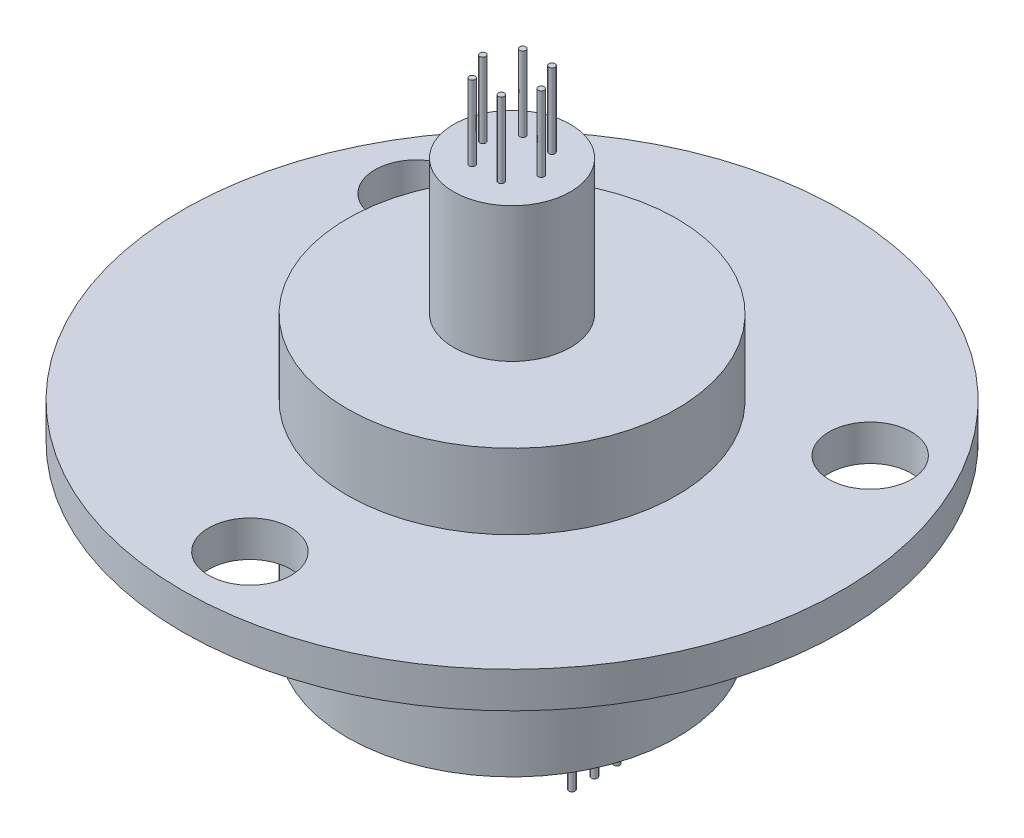
ISO-10303-21;
HEADER;
FILE_DESCRIPTION(('STEP AP214'),'2;1');
FILE_NAME('part.step','',(''),(''),'','','');
FILE_SCHEMA(('AUTOMOTIVE_DESIGN { 1 0 10303 214 1 1 1 1 }'));
ENDSEC;
DATA;
#1=APPLICATION_CONTEXT('core data for automotive mechanical design processes');
#2=APPLICATION_PROTOCOL_DEFINITION('international standard','automotive_design',2000,#1);
#3=PRODUCT_CONTEXT('',#1,'mechanical');
#4=PRODUCT('Part','Part','',(#3));
#5=PRODUCT_RELATED_PRODUCT_CATEGORY('part','',(#4));
#6=PRODUCT_DEFINITION_FORMATION('','',#4);
#7=PRODUCT_DEFINITION_CONTEXT('part definition',#1,'design');
#8=PRODUCT_DEFINITION('design','',#6,#7);
#9=PRODUCT_DEFINITION_SHAPE('','',#8);
#10=(LENGTH_UNIT() NAMED_UNIT(*) SI_UNIT(.MILLI.,.METRE.));
#11=(NAMED_UNIT(*) PLANE_ANGLE_UNIT() SI_UNIT($,.RADIAN.));
#12=(NAMED_UNIT(*) SI_UNIT($,.STERADIAN.) SOLID_ANGLE_UNIT());
#13=UNCERTAINTY_MEASURE_WITH_UNIT(LENGTH_MEASURE(1.E-05),#10,'distance_accuracy_value','');
#14=(GEOMETRIC_REPRESENTATION_CONTEXT(3) GLOBAL_UNCERTAINTY_ASSIGNED_CONTEXT((#13)) GLOBAL_UNIT_ASSIGNED_CONTEXT((#10,
#11,#12)) REPRESENTATION_CONTEXT('',''));
#15=CARTESIAN_POINT('',(0.,0.,0.));
#16=DIRECTION('',(0.,0.,1.));
#17=DIRECTION('',(1.,0.,0.));
#18=AXIS2_PLACEMENT_3D('',#15,#16,#17);
#19=CARTESIAN_POINT('',(0.97500000000002,20.2,-1.68874953737964));
#20=DIRECTION('',(0.,-1.,0.));
#21=DIRECTION('',(0.,0.,-1.));
#22=AXIS2_PLACEMENT_3D('',#19,#20,#21);
#23=CYLINDRICAL_SURFACE('',#22,0.2025);
#24=CARTESIAN_POINT('',(0.97500000000002,20.2,-1.68874953737964));
#25=DIRECTION('',(0.,1.,0.));
#26=DIRECTION('',(0.,0.,1.));
#27=AXIS2_PLACEMENT_3D('',#24,#25,#26);
#28=CIRCLE('',#27,0.2025);
#29=CARTESIAN_POINT('',(0.97500000000002,20.2,-1.48624953737964));
#30=VERTEX_POINT('',#29);
#31=EDGE_CURVE('E11',#30,#30,#28,.T.);
#32=ORIENTED_EDGE('',*,*,#31,.F.);
#33=EDGE_LOOP('',(#32));
#34=FACE_BOUND('',#33,.T.);
#35=CARTESIAN_POINT('',(0.97500000000002,15.2,-1.68874953737964));
#36=DIRECTION('',(0.,1.,0.));
#37=DIRECTION('',(0.,0.,1.));
#38=AXIS2_PLACEMENT_3D('',#35,#36,#37);
#39=CIRCLE('',#38,0.2025);
#40=CARTESIAN_POINT('',(0.97500000000002,15.2,-1.48624953737964));
#41=VERTEX_POINT('',#40);
#42=EDGE_CURVE('E48',#41,#41,#39,.T.);
#43=ORIENTED_EDGE('',*,*,#42,.T.);
#44=EDGE_LOOP('',(#43));
#45=FACE_BOUND('',#44,.T.);
#46=ADVANCED_FACE('F45',(#34,#45),#23,.T.);
#47=CARTESIAN_POINT('',(0.97500000000002,20.2,-1.68874953737964));
#48=DIRECTION('',(0.,1.,0.));
#49=DIRECTION('',(0.,0.,1.));
#50=AXIS2_PLACEMENT_3D('',#47,#48,#49);
#51=PLANE('',#50);
#52=ORIENTED_EDGE('',*,*,#31,.T.);
#53=EDGE_LOOP('',(#52));
#54=FACE_BOUND('',#53,.T.);
#55=ADVANCED_FACE('F60',(#54),#51,.T.);
#56=CARTESIAN_POINT('',(0.97500000000002,15.2,-1.68874953737964));
#57=DIRECTION('',(0.,1.,0.));
#58=DIRECTION('',(0.,0.,1.));
#59=AXIS2_PLACEMENT_3D('',#56,#57,#58);
#60=PLANE('',#59);
#61=ORIENTED_EDGE('',*,*,#42,.F.);
#62=EDGE_LOOP('',(#61));
#63=FACE_BOUND('',#62,.T.);
#64=ADVANCED_FACE('F58',(#63),#60,.F.);
#65=CLOSED_SHELL('',(#46,#55,#64));
#66=MANIFOLD_SOLID_BREP('B2',#65);
#67=CARTESIAN_POINT('',(-0.974999999999984,20.2,-1.68874953737966));
#68=DIRECTION('',(0.,-1.,0.));
#69=DIRECTION('',(0.,0.,-1.));
#70=AXIS2_PLACEMENT_3D('',#67,#68,#69);
#71=CYLINDRICAL_SURFACE('',#70,0.2025);
#72=CARTESIAN_POINT('',(-0.974999999999984,20.2,-1.68874953737966));
#73=DIRECTION('',(0.,1.,0.));
#74=DIRECTION('',(0.,0.,1.));
#75=AXIS2_PLACEMENT_3D('',#72,#73,#74);
#76=CIRCLE('',#75,0.2025);
#77=CARTESIAN_POINT('',(-0.974999999999984,20.2,-1.48624953737966));
#78=VERTEX_POINT('',#77);
#79=EDGE_CURVE('E44',#78,#78,#76,.T.);
#80=ORIENTED_EDGE('',*,*,#79,.F.);
#81=EDGE_LOOP('',(#80));
#82=FACE_BOUND('',#81,.T.);
#83=CARTESIAN_POINT('',(-0.974999999999984,15.2,-1.68874953737966));
#84=DIRECTION('',(0.,1.,0.));
#85=DIRECTION('',(0.,0.,1.));
#86=AXIS2_PLACEMENT_3D('',#83,#84,#85);
#87=CIRCLE('',#86,0.2025);
#88=CARTESIAN_POINT('',(-0.974999999999984,15.2,-1.48624953737966));
#89=VERTEX_POINT('',#88);
#90=EDGE_CURVE('E98',#89,#89,#87,.T.);
#91=ORIENTED_EDGE('',*,*,#90,.T.);
#92=EDGE_LOOP('',(#91));
#93=FACE_BOUND('',#92,.T.);
#94=ADVANCED_FACE('F95',(#82,#93),#71,.T.);
#95=CARTESIAN_POINT('',(-0.974999999999984,20.2,-1.68874953737966));
#96=DIRECTION('',(0.,1.,0.));
#97=DIRECTION('',(0.,0.,1.));
#98=AXIS2_PLACEMENT_3D('',#95,#96,#97);
#99=PLANE('',#98);
#100=ORIENTED_EDGE('',*,*,#79,.T.);
#101=EDGE_LOOP('',(#100));
#102=FACE_BOUND('',#101,.T.);
#103=ADVANCED_FACE('F110',(#102),#99,.T.);
#104=CARTESIAN_POINT('',(-0.974999999999984,15.2,-1.68874953737966));
#105=DIRECTION('',(0.,1.,0.));
#106=DIRECTION('',(0.,0.,1.));
#107=AXIS2_PLACEMENT_3D('',#104,#105,#106);
#108=PLANE('',#107);
#109=ORIENTED_EDGE('',*,*,#90,.F.);
#110=EDGE_LOOP('',(#109));
#111=FACE_BOUND('',#110,.T.);
#112=ADVANCED_FACE('F108',(#111),#108,.F.);
#113=CLOSED_SHELL('',(#94,#103,#112));
#114=MANIFOLD_SOLID_BREP('B6',#113);
#115=CARTESIAN_POINT('',(-1.95,20.2,0.));
#116=DIRECTION('',(0.,-1.,0.));
#117=DIRECTION('',(0.,0.,-1.));
#118=AXIS2_PLACEMENT_3D('',#115,#116,#117);
#119=CYLINDRICAL_SURFACE('',#118,0.2025);
#120=CARTESIAN_POINT('',(-1.95,20.2,0.));
#121=DIRECTION('',(0.,1.,0.));
#122=DIRECTION('',(0.,0.,1.));
#123=AXIS2_PLACEMENT_3D('',#120,#121,#122);
#124=CIRCLE('',#123,0.2025);
#125=CARTESIAN_POINT('',(-1.95,20.2,0.202499999999986));
#126=VERTEX_POINT('',#125);
#127=EDGE_CURVE('E94',#126,#126,#124,.T.);
#128=ORIENTED_EDGE('',*,*,#127,.F.);
#129=EDGE_LOOP('',(#128));
#130=FACE_BOUND('',#129,.T.);
#131=CARTESIAN_POINT('',(-1.95,15.2,0.));
#132=DIRECTION('',(0.,1.,0.));
#133=DIRECTION('',(0.,0.,1.));
#134=AXIS2_PLACEMENT_3D('',#131,#132,#133);
#135=CIRCLE('',#134,0.2025);
#136=CARTESIAN_POINT('',(-1.95,15.2,0.202499999999986));
#137=VERTEX_POINT('',#136);
#138=EDGE_CURVE('E148',#137,#137,#135,.T.);
#139=ORIENTED_EDGE('',*,*,#138,.T.);
#140=EDGE_LOOP('',(#139));
#141=FACE_BOUND('',#140,.T.);
#142=ADVANCED_FACE('F145',(#130,#141),#119,.T.);
#143=CARTESIAN_POINT('',(-1.95,20.2,0.));
#144=DIRECTION('',(0.,1.,0.));
#145=DIRECTION('',(0.,0.,1.));
#146=AXIS2_PLACEMENT_3D('',#143,#144,#145);
#147=PLANE('',#146);
#148=ORIENTED_EDGE('',*,*,#127,.T.);
#149=EDGE_LOOP('',(#148));
#150=FACE_BOUND('',#149,.T.);
#151=ADVANCED_FACE('F160',(#150),#147,.T.);
#152=CARTESIAN_POINT('',(-1.95,15.2,0.));
#153=DIRECTION('',(0.,1.,0.));
#154=DIRECTION('',(0.,0.,1.));
#155=AXIS2_PLACEMENT_3D('',#152,#153,#154);
#156=PLANE('',#155);
#157=ORIENTED_EDGE('',*,*,#138,.F.);
#158=EDGE_LOOP('',(#157));
#159=FACE_BOUND('',#158,.T.);
#160=ADVANCED_FACE('F158',(#159),#156,.F.);
#161=CLOSED_SHELL('',(#142,#151,#160));
#162=MANIFOLD_SOLID_BREP('B39',#161);
#163=CARTESIAN_POINT('',(-0.975000000000008,20.2,1.68874953737965));
#164=DIRECTION('',(0.,-1.,0.));
#165=DIRECTION('',(0.,0.,-1.));
#166=AXIS2_PLACEMENT_3D('',#163,#164,#165);
#167=CYLINDRICAL_SURFACE('',#166,0.2025);
#168=CARTESIAN_POINT('',(-0.975000000000008,20.2,1.68874953737965));
#169=DIRECTION('',(0.,1.,0.));
#170=DIRECTION('',(0.,0.,1.));
#171=AXIS2_PLACEMENT_3D('',#168,#169,#170);
#172=CIRCLE('',#171,0.2025);
#173=CARTESIAN_POINT('',(-0.975000000000008,20.2,1.89124953737965));
#174=VERTEX_POINT('',#173);
#175=EDGE_CURVE('E144',#174,#174,#172,.T.);
#176=ORIENTED_EDGE('',*,*,#175,.F.);
#177=EDGE_LOOP('',(#176));
#178=FACE_BOUND('',#177,.T.);
#179=CARTESIAN_POINT('',(-0.975000000000008,15.2,1.68874953737965));
#180=DIRECTION('',(0.,1.,0.));
#181=DIRECTION('',(0.,0.,1.));
#182=AXIS2_PLACEMENT_3D('',#179,#180,#181);
#183=CIRCLE('',#182,0.2025);
#184=CARTESIAN_POINT('',(-0.975000000000008,15.2,1.89124953737965));
#185=VERTEX_POINT('',#184);
#186=EDGE_CURVE('E198',#185,#185,#183,.T.);
#187=ORIENTED_EDGE('',*,*,#186,.T.);
#188=EDGE_LOOP('',(#187));
#189=FACE_BOUND('',#188,.T.);
#190=ADVANCED_FACE('F195',(#178,#189),#167,.T.);
#191=CARTESIAN_POINT('',(-0.975000000000008,20.2,1.68874953737965));
#192=DIRECTION('',(0.,1.,0.));
#193=DIRECTION('',(0.,0.,1.));
#194=AXIS2_PLACEMENT_3D('',#191,#192,#193);
#195=PLANE('',#194);
#196=ORIENTED_EDGE('',*,*,#175,.T.);
#197=EDGE_LOOP('',(#196));
#198=FACE_BOUND('',#197,.T.);
#199=ADVANCED_FACE('F210',(#198),#195,.T.);
#200=CARTESIAN_POINT('',(-0.975000000000008,15.2,1.68874953737965));
#201=DIRECTION('',(0.,1.,0.));
#202=DIRECTION('',(0.,0.,1.));
#203=AXIS2_PLACEMENT_3D('',#200,#201,#202);
#204=PLANE('',#203);
#205=ORIENTED_EDGE('',*,*,#186,.F.);
#206=EDGE_LOOP('',(#205));
#207=FACE_BOUND('',#206,.T.);
#208=ADVANCED_FACE('F208',(#207),#204,.F.);
#209=CLOSED_SHELL('',(#190,#199,#208));
#210=MANIFOLD_SOLID_BREP('B89',#209);
#211=CARTESIAN_POINT('',(0.974999999999996,20.2,1.68874953737966));
#212=DIRECTION('',(0.,-1.,0.));
#213=DIRECTION('',(0.,0.,-1.));
#214=AXIS2_PLACEMENT_3D('',#211,#212,#213);
#215=CYLINDRICAL_SURFACE('',#214,0.2025);
#216=CARTESIAN_POINT('',(0.974999999999996,20.2,1.68874953737966));
#217=DIRECTION('',(0.,1.,0.));
#218=DIRECTION('',(0.,0.,1.));
#219=AXIS2_PLACEMENT_3D('',#216,#217,#218);
#220=CIRCLE('',#219,0.2025);
#221=CARTESIAN_POINT('',(0.974999999999996,20.2,1.89124953737966));
#222=VERTEX_POINT('',#221);
#223=EDGE_CURVE('E194',#222,#222,#220,.T.);
#224=ORIENTED_EDGE('',*,*,#223,.F.);
#225=EDGE_LOOP('',(#224));
#226=FACE_BOUND('',#225,.T.);
#227=CARTESIAN_POINT('',(0.974999999999996,15.2,1.68874953737966));
#228=DIRECTION('',(0.,1.,0.));
#229=DIRECTION('',(0.,0.,1.));
#230=AXIS2_PLACEMENT_3D('',#227,#228,#229);
#231=CIRCLE('',#230,0.2025);
#232=CARTESIAN_POINT('',(0.974999999999996,15.2,1.89124953737966));
#233=VERTEX_POINT('',#232);
#234=EDGE_CURVE('E248',#233,#233,#231,.T.);
#235=ORIENTED_EDGE('',*,*,#234,.T.);
#236=EDGE_LOOP('',(#235));
#237=FACE_BOUND('',#236,.T.);
#238=ADVANCED_FACE('F245',(#226,#237),#215,.T.);
#239=CARTESIAN_POINT('',(0.974999999999996,20.2,1.68874953737966));
#240=DIRECTION('',(0.,1.,0.));
#241=DIRECTION('',(0.,0.,1.));
#242=AXIS2_PLACEMENT_3D('',#239,#240,#241);
#243=PLANE('',#242);
#244=ORIENTED_EDGE('',*,*,#223,.T.);
#245=EDGE_LOOP('',(#244));
#246=FACE_BOUND('',#245,.T.);
#247=ADVANCED_FACE('F260',(#246),#243,.T.);
#248=CARTESIAN_POINT('',(0.974999999999996,15.2,1.68874953737966));
#249=DIRECTION('',(0.,1.,0.));
#250=DIRECTION('',(0.,0.,1.));
#251=AXIS2_PLACEMENT_3D('',#248,#249,#250);
#252=PLANE('',#251);
#253=ORIENTED_EDGE('',*,*,#234,.F.);
#254=EDGE_LOOP('',(#253));
#255=FACE_BOUND('',#254,.T.);
#256=ADVANCED_FACE('F258',(#255),#252,.F.);
#257=CLOSED_SHELL('',(#238,#247,#256));
#258=MANIFOLD_SOLID_BREP('B139',#257);
#259=CARTESIAN_POINT('',(1.95,20.2,0.));
#260=DIRECTION('',(0.,-1.,0.));
#261=DIRECTION('',(0.,0.,-1.));
#262=AXIS2_PLACEMENT_3D('',#259,#260,#261);
#263=CYLINDRICAL_SURFACE('',#262,0.2025);
#264=CARTESIAN_POINT('',(1.95,20.2,0.));
#265=DIRECTION('',(0.,1.,0.));
#266=DIRECTION('',(0.,0.,1.));
#267=AXIS2_PLACEMENT_3D('',#264,#265,#266);
#268=CIRCLE('',#267,0.2025);
#269=CARTESIAN_POINT('',(1.95,20.2,0.2025));
#270=VERTEX_POINT('',#269);
#271=EDGE_CURVE('E244',#270,#270,#268,.T.);
#272=ORIENTED_EDGE('',*,*,#271,.F.);
#273=EDGE_LOOP('',(#272));
#274=FACE_BOUND('',#273,.T.);
#275=CARTESIAN_POINT('',(1.95,15.2,0.));
#276=DIRECTION('',(0.,1.,0.));
#277=DIRECTION('',(0.,0.,1.));
#278=AXIS2_PLACEMENT_3D('',#275,#276,#277);
#279=CIRCLE('',#278,0.2025);
#280=CARTESIAN_POINT('',(1.95,15.2,0.2025));
#281=VERTEX_POINT('',#280);
#282=EDGE_CURVE('E297',#281,#281,#279,.T.);
#283=ORIENTED_EDGE('',*,*,#282,.T.);
#284=EDGE_LOOP('',(#283));
#285=FACE_BOUND('',#284,.T.);
#286=ADVANCED_FACE('F294',(#274,#285),#263,.T.);
#287=CARTESIAN_POINT('',(1.95,20.2,0.));
#288=DIRECTION('',(0.,1.,0.));
#289=DIRECTION('',(0.,0.,1.));
#290=AXIS2_PLACEMENT_3D('',#287,#288,#289);
#291=PLANE('',#290);
#292=ORIENTED_EDGE('',*,*,#271,.T.);
#293=EDGE_LOOP('',(#292));
#294=FACE_BOUND('',#293,.T.);
#295=ADVANCED_FACE('F309',(#294),#291,.T.);
#296=CARTESIAN_POINT('',(1.95,15.2,0.));
#297=DIRECTION('',(0.,1.,0.));
#298=DIRECTION('',(0.,0.,1.));
#299=AXIS2_PLACEMENT_3D('',#296,#297,#298);
#300=PLANE('',#299);
#301=ORIENTED_EDGE('',*,*,#282,.F.);
#302=EDGE_LOOP('',(#301));
#303=FACE_BOUND('',#302,.T.);
#304=ADVANCED_FACE('F307',(#303),#300,.F.);
#305=CLOSED_SHELL('',(#286,#295,#304));
#306=MANIFOLD_SOLID_BREP('B189',#305);
#307=CARTESIAN_POINT('',(0.,1.2,0.));
#308=DIRECTION('',(0.,1.,0.));
#309=DIRECTION('',(0.,0.,1.));
#310=AXIS2_PLACEMENT_3D('',#307,#308,#309);
#311=PLANE('',#310);
#312=CARTESIAN_POINT('',(0.,1.2,0.));
#313=DIRECTION('',(0.,1.,0.));
#314=DIRECTION('',(0.,0.,1.));
#315=AXIS2_PLACEMENT_3D('',#312,#313,#314);
#316=CIRCLE('',#315,11.);
#317=CARTESIAN_POINT('',(0.,1.2,11.));
#318=VERTEX_POINT('',#317);
#319=EDGE_CURVE('E349',#318,#318,#316,.T.);
#320=ORIENTED_EDGE('',*,*,#319,.F.);
#321=EDGE_LOOP('',(#320));
#322=FACE_BOUND('',#321,.T.);
#323=CARTESIAN_POINT('',(1.12042546192999E-12,1.2,17.5000000000007));
#324=DIRECTION('',(0.,1.,0.));
#325=DIRECTION('',(0.,0.,1.));
#326=AXIS2_PLACEMENT_3D('',#323,#324,#325);
#327=CIRCLE('',#326,2.74999999999963);
#328=CARTESIAN_POINT('',(1.12042546192999E-12,1.2,20.2500000000003));
#329=VERTEX_POINT('',#328);
#330=EDGE_CURVE('E371',#329,#329,#327,.T.);
#331=ORIENTED_EDGE('',*,*,#330,.F.);
#332=EDGE_LOOP('',(#331));
#333=FACE_BOUND('',#332,.T.);
#334=CARTESIAN_POINT('',(0.,1.2,0.));
#335=DIRECTION('',(0.,1.,0.));
#336=DIRECTION('',(0.,0.,1.));
#337=AXIS2_PLACEMENT_3D('',#334,#335,#336);
#338=CIRCLE('',#337,22.);
#339=CARTESIAN_POINT('',(0.,1.2,22.));
#340=VERTEX_POINT('',#339);
#341=EDGE_CURVE('E364',#340,#340,#338,.T.);
#342=ORIENTED_EDGE('',*,*,#341,.T.);
#343=EDGE_LOOP('',(#342));
#344=FACE_BOUND('',#343,.T.);
#345=CARTESIAN_POINT('',(15.1554445662277,1.2,-8.75000000000002));
#346=DIRECTION('',(0.,1.,0.));
#347=DIRECTION('',(0.,0.,1.));
#348=AXIS2_PLACEMENT_3D('',#345,#346,#347);
#349=CIRCLE('',#348,2.75);
#350=CARTESIAN_POINT('',(15.1554445662277,1.2,-6.00000000000002));
#351=VERTEX_POINT('',#350);
#352=EDGE_CURVE('E377',#351,#351,#349,.T.);
#353=ORIENTED_EDGE('',*,*,#352,.F.);
#354=EDGE_LOOP('',(#353));
#355=FACE_BOUND('',#354,.T.);
#356=CARTESIAN_POINT('',(-15.1554445662277,1.2,-8.7499999999987));
#357=DIRECTION('',(0.,1.,0.));
#358=DIRECTION('',(0.,0.,1.));
#359=AXIS2_PLACEMENT_3D('',#356,#357,#358);
#360=CIRCLE('',#359,2.75000000000089);
#361=CARTESIAN_POINT('',(-15.1554445662277,1.2,-5.99999999999781));
#362=VERTEX_POINT('',#361);
#363=EDGE_CURVE('E365',#362,#362,#360,.T.);
#364=ORIENTED_EDGE('',*,*,#363,.F.);
#365=EDGE_LOOP('',(#364));
#366=FACE_BOUND('',#365,.T.);
#367=ADVANCED_FACE('F336',(#322,#333,#344,#355,#366),#311,.T.);
#368=CARTESIAN_POINT('',(0.,-1.2,0.));
#369=DIRECTION('',(0.,1.,0.));
#370=DIRECTION('',(0.,0.,1.));
#371=AXIS2_PLACEMENT_3D('',#368,#369,#370);
#372=PLANE('',#371);
#373=CARTESIAN_POINT('',(0.,-1.2,0.));
#374=DIRECTION('',(0.,-1.,0.));
#375=DIRECTION('',(0.,0.,-1.));
#376=AXIS2_PLACEMENT_3D('',#373,#374,#375);
#377=CIRCLE('',#376,11.);
#378=CARTESIAN_POINT('',(0.,-1.2,-11.));
#379=VERTEX_POINT('',#378);
#380=EDGE_CURVE('E293',#379,#379,#377,.T.);
#381=ORIENTED_EDGE('',*,*,#380,.F.);
#382=EDGE_LOOP('',(#381));
#383=FACE_BOUND('',#382,.T.);
#384=CARTESIAN_POINT('',(0.,-1.2,0.));
#385=DIRECTION('',(0.,1.,0.));
#386=DIRECTION('',(0.,0.,1.));
#387=AXIS2_PLACEMENT_3D('',#384,#385,#386);
#388=CIRCLE('',#387,22.);
#389=CARTESIAN_POINT('',(0.,-1.2,22.));
#390=VERTEX_POINT('',#389);
#391=EDGE_CURVE('E340',#390,#390,#388,.T.);
#392=ORIENTED_EDGE('',*,*,#391,.F.);
#393=EDGE_LOOP('',(#392));
#394=FACE_BOUND('',#393,.T.);
#395=CARTESIAN_POINT('',(15.1554445662277,-1.2,-8.75000000000002));
#396=DIRECTION('',(0.,1.,0.));
#397=DIRECTION('',(0.,0.,1.));
#398=AXIS2_PLACEMENT_3D('',#395,#396,#397);
#399=CIRCLE('',#398,2.75);
#400=CARTESIAN_POINT('',(15.1554445662277,-1.2,-6.00000000000002));
#401=VERTEX_POINT('',#400);
#402=EDGE_CURVE('E374',#401,#401,#399,.T.);
#403=ORIENTED_EDGE('',*,*,#402,.T.);
#404=EDGE_LOOP('',(#403));
#405=FACE_BOUND('',#404,.T.);
#406=CARTESIAN_POINT('',(1.12042546192999E-12,-1.2,17.5000000000007));
#407=DIRECTION('',(0.,1.,0.));
#408=DIRECTION('',(0.,0.,1.));
#409=AXIS2_PLACEMENT_3D('',#406,#407,#408);
#410=CIRCLE('',#409,2.74999999999963);
#411=CARTESIAN_POINT('',(1.12042546192999E-12,-1.2,20.2500000000003));
#412=VERTEX_POINT('',#411);
#413=EDGE_CURVE('E368',#412,#412,#410,.T.);
#414=ORIENTED_EDGE('',*,*,#413,.T.);
#415=EDGE_LOOP('',(#414));
#416=FACE_BOUND('',#415,.T.);
#417=CARTESIAN_POINT('',(-15.1554445662277,-1.2,-8.7499999999987));
#418=DIRECTION('',(0.,1.,0.));
#419=DIRECTION('',(0.,0.,1.));
#420=AXIS2_PLACEMENT_3D('',#417,#418,#419);
#421=CIRCLE('',#420,2.75000000000089);
#422=CARTESIAN_POINT('',(-15.1554445662277,-1.2,-5.99999999999781));
#423=VERTEX_POINT('',#422);
#424=EDGE_CURVE('E361',#423,#423,#421,.T.);
#425=ORIENTED_EDGE('',*,*,#424,.T.);
#426=EDGE_LOOP('',(#425));
#427=FACE_BOUND('',#426,.T.);
#428=ADVANCED_FACE('F388',(#383,#394,#405,#416,#427),#372,.F.);
#429=CARTESIAN_POINT('',(0.,1.2,0.));
#430=DIRECTION('',(0.,-1.,0.));
#431=DIRECTION('',(0.,0.,-1.));
#432=AXIS2_PLACEMENT_3D('',#429,#430,#431);
#433=CYLINDRICAL_SURFACE('',#432,22.);
#434=ORIENTED_EDGE('',*,*,#341,.F.);
#435=EDGE_LOOP('',(#434));
#436=FACE_BOUND('',#435,.T.);
#437=ORIENTED_EDGE('',*,*,#391,.T.);
#438=EDGE_LOOP('',(#437));
#439=FACE_BOUND('',#438,.T.);
#440=ADVANCED_FACE('F338',(#436,#439),#433,.T.);
#441=CARTESIAN_POINT('',(15.1554445662277,1.2,-8.75000000000002));
#442=DIRECTION('',(0.,-1.,0.));
#443=DIRECTION('',(0.,0.,-1.));
#444=AXIS2_PLACEMENT_3D('',#441,#442,#443);
#445=CYLINDRICAL_SURFACE('',#444,2.75);
#446=ORIENTED_EDGE('',*,*,#352,.T.);
#447=EDGE_LOOP('',(#446));
#448=FACE_BOUND('',#447,.T.);
#449=ORIENTED_EDGE('',*,*,#402,.F.);
#450=EDGE_LOOP('',(#449));
#451=FACE_BOUND('',#450,.T.);
#452=ADVANCED_FACE('F411',(#448,#451),#445,.F.);
#453=CARTESIAN_POINT('',(1.12042546192999E-12,1.2,17.5000000000007));
#454=DIRECTION('',(0.,-1.,0.));
#455=DIRECTION('',(0.,0.,-1.));
#456=AXIS2_PLACEMENT_3D('',#453,#454,#455);
#457=CYLINDRICAL_SURFACE('',#456,2.74999999999963);
#458=ORIENTED_EDGE('',*,*,#330,.T.);
#459=EDGE_LOOP('',(#458));
#460=FACE_BOUND('',#459,.T.);
#461=ORIENTED_EDGE('',*,*,#413,.F.);
#462=EDGE_LOOP('',(#461));
#463=FACE_BOUND('',#462,.T.);
#464=ADVANCED_FACE('F401',(#460,#463),#457,.F.);
#465=CARTESIAN_POINT('',(-15.1554445662277,1.2,-8.7499999999987));
#466=DIRECTION('',(0.,-1.,0.));
#467=DIRECTION('',(0.,0.,-1.));
#468=AXIS2_PLACEMENT_3D('',#465,#466,#467);
#469=CYLINDRICAL_SURFACE('',#468,2.75000000000089);
#470=ORIENTED_EDGE('',*,*,#363,.T.);
#471=EDGE_LOOP('',(#470));
#472=FACE_BOUND('',#471,.T.);
#473=ORIENTED_EDGE('',*,*,#424,.F.);
#474=EDGE_LOOP('',(#473));
#475=FACE_BOUND('',#474,.T.);
#476=ADVANCED_FACE('F398',(#472,#475),#469,.F.);
#477=CARTESIAN_POINT('',(0.,6.2,0.));
#478=DIRECTION('',(0.,-1.,0.));
#479=DIRECTION('',(0.,0.,-1.));
#480=AXIS2_PLACEMENT_3D('',#477,#478,#479);
#481=CYLINDRICAL_SURFACE('',#480,11.);
#482=CARTESIAN_POINT('',(0.,6.2,0.));
#483=DIRECTION('',(0.,1.,0.));
#484=DIRECTION('',(0.,0.,1.));
#485=AXIS2_PLACEMENT_3D('',#482,#483,#484);
#486=CIRCLE('',#485,11.);
#487=CARTESIAN_POINT('',(0.,6.2,11.));
#488=VERTEX_POINT('',#487);
#489=EDGE_CURVE('E357',#488,#488,#486,.T.);
#490=ORIENTED_EDGE('',*,*,#489,.F.);
#491=EDGE_LOOP('',(#490));
#492=FACE_BOUND('',#491,.T.);
#493=ORIENTED_EDGE('',*,*,#319,.T.);
#494=EDGE_LOOP('',(#493));
#495=FACE_BOUND('',#494,.T.);
#496=ADVANCED_FACE('F400',(#492,#495),#481,.T.);
#497=CARTESIAN_POINT('',(0.,6.2,0.));
#498=DIRECTION('',(0.,1.,0.));
#499=DIRECTION('',(0.,0.,1.));
#500=AXIS2_PLACEMENT_3D('',#497,#498,#499);
#501=PLANE('',#500);
#502=CARTESIAN_POINT('',(0.,6.2,0.));
#503=DIRECTION('',(0.,1.,0.));
#504=DIRECTION('',(0.,0.,1.));
#505=AXIS2_PLACEMENT_3D('',#502,#503,#504);
#506=CIRCLE('',#505,3.9);
#507=CARTESIAN_POINT('',(0.,6.2,3.9));
#508=VERTEX_POINT('',#507);
#509=EDGE_CURVE('E344',#508,#508,#506,.T.);
#510=ORIENTED_EDGE('',*,*,#509,.F.);
#511=EDGE_LOOP('',(#510));
#512=FACE_BOUND('',#511,.T.);
#513=ORIENTED_EDGE('',*,*,#489,.T.);
#514=EDGE_LOOP('',(#513));
#515=FACE_BOUND('',#514,.T.);
#516=ADVANCED_FACE('F408',(#512,#515),#501,.T.);
#517=CARTESIAN_POINT('',(0.,15.2,0.));
#518=DIRECTION('',(0.,-1.,0.));
#519=DIRECTION('',(0.,0.,-1.));
#520=AXIS2_PLACEMENT_3D('',#517,#518,#519);
#521=CYLINDRICAL_SURFACE('',#520,3.9);
#522=CARTESIAN_POINT('',(0.,15.2,0.));
#523=DIRECTION('',(0.,1.,0.));
#524=DIRECTION('',(0.,0.,1.));
#525=AXIS2_PLACEMENT_3D('',#522,#523,#524);
#526=CIRCLE('',#525,3.9);
#527=CARTESIAN_POINT('',(0.,15.2,3.9));
#528=VERTEX_POINT('',#527);
#529=EDGE_CURVE('E355',#528,#528,#526,.T.);
#530=ORIENTED_EDGE('',*,*,#529,.F.);
#531=EDGE_LOOP('',(#530));
#532=FACE_BOUND('',#531,.T.);
#533=ORIENTED_EDGE('',*,*,#509,.T.);
#534=EDGE_LOOP('',(#533));
#535=FACE_BOUND('',#534,.T.);
#536=ADVANCED_FACE('F600',(#532,#535),#521,.T.);
#537=CARTESIAN_POINT('',(0.,15.2,0.));
#538=DIRECTION('',(0.,1.,0.));
#539=DIRECTION('',(0.,0.,1.));
#540=AXIS2_PLACEMENT_3D('',#537,#538,#539);
#541=PLANE('',#540);
#542=ORIENTED_EDGE('',*,*,#529,.T.);
#543=EDGE_LOOP('',(#542));
#544=FACE_BOUND('',#543,.T.);
#545=ADVANCED_FACE('F446',(#544),#541,.T.);
#546=CARTESIAN_POINT('',(0.,-12.8,0.));
#547=DIRECTION('',(0.,1.,0.));
#548=DIRECTION('',(0.,0.,1.));
#549=AXIS2_PLACEMENT_3D('',#546,#547,#548);
#550=CYLINDRICAL_SURFACE('',#549,11.);
#551=CARTESIAN_POINT('',(0.,-12.8,0.));
#552=DIRECTION('',(0.,-1.,0.));
#553=DIRECTION('',(0.,0.,-1.));
#554=AXIS2_PLACEMENT_3D('',#551,#552,#553);
#555=CIRCLE('',#554,11.);
#556=CARTESIAN_POINT('',(0.,-12.8,-11.));
#557=VERTEX_POINT('',#556);
#558=EDGE_CURVE('E353',#557,#557,#555,.T.);
#559=ORIENTED_EDGE('',*,*,#558,.F.);
#560=EDGE_LOOP('',(#559));
#561=FACE_BOUND('',#560,.T.);
#562=ORIENTED_EDGE('',*,*,#380,.T.);
#563=EDGE_LOOP('',(#562));
#564=FACE_BOUND('',#563,.T.);
#565=ADVANCED_FACE('F451',(#561,#564),#550,.T.);
#566=CARTESIAN_POINT('',(0.,-12.8,0.));
#567=DIRECTION('',(0.,-1.,0.));
#568=DIRECTION('',(0.,0.,-1.));
#569=AXIS2_PLACEMENT_3D('',#566,#567,#568);
#570=PLANE('',#569);
#571=CARTESIAN_POINT('',(-5.5,-12.8,1.5));
#572=DIRECTION('',(0.,-1.,0.));
#573=DIRECTION('',(0.,0.,1.));
#574=AXIS2_PLACEMENT_3D('',#571,#572,#573);
#575=CIRCLE('',#574,0.2025);
#576=CARTESIAN_POINT('',(-5.5,-12.8,1.7025));
#577=VERTEX_POINT('',#576);
#578=EDGE_CURVE('E655',#577,#577,#575,.T.);
#579=ORIENTED_EDGE('',*,*,#578,.F.);
#580=EDGE_LOOP('',(#579));
#581=FACE_BOUND('',#580,.T.);
#582=CARTESIAN_POINT('',(-5.5,-12.8,0.));
#583=DIRECTION('',(0.,-1.,0.));
#584=DIRECTION('',(0.,0.,1.));
#585=AXIS2_PLACEMENT_3D('',#582,#583,#584);
#586=CIRCLE('',#585,0.2025);
#587=CARTESIAN_POINT('',(-5.5,-12.8,0.2025));
#588=VERTEX_POINT('',#587);
#589=EDGE_CURVE('E654',#588,#588,#586,.T.);
#590=ORIENTED_EDGE('',*,*,#589,.F.);
#591=EDGE_LOOP('',(#590));
#592=FACE_BOUND('',#591,.T.);
#593=CARTESIAN_POINT('',(-5.5,-12.8,-1.5));
#594=DIRECTION('',(0.,-1.,0.));
#595=DIRECTION('',(0.,0.,1.));
#596=AXIS2_PLACEMENT_3D('',#593,#594,#595);
#597=CIRCLE('',#596,0.2025);
#598=CARTESIAN_POINT('',(-5.5,-12.8,-1.2975));
#599=VERTEX_POINT('',#598);
#600=EDGE_CURVE('E664',#599,#599,#597,.T.);
#601=ORIENTED_EDGE('',*,*,#600,.F.);
#602=EDGE_LOOP('',(#601));
#603=FACE_BOUND('',#602,.T.);
#604=CARTESIAN_POINT('',(5.5,-12.8,-1.5));
#605=DIRECTION('',(0.,-1.,0.));
#606=DIRECTION('',(0.,0.,-1.));
#607=AXIS2_PLACEMENT_3D('',#604,#605,#606);
#608=CIRCLE('',#607,0.2025);
#609=CARTESIAN_POINT('',(5.5,-12.8,-1.7025));
#610=VERTEX_POINT('',#609);
#611=EDGE_CURVE('E669',#610,#610,#608,.T.);
#612=ORIENTED_EDGE('',*,*,#611,.F.);
#613=EDGE_LOOP('',(#612));
#614=FACE_BOUND('',#613,.T.);
#615=CARTESIAN_POINT('',(5.5,-12.8,1.5));
#616=DIRECTION('',(0.,-1.,0.));
#617=DIRECTION('',(0.,0.,-1.));
#618=AXIS2_PLACEMENT_3D('',#615,#616,#617);
#619=CIRCLE('',#618,0.2025);
#620=CARTESIAN_POINT('',(5.5,-12.8,1.2975));
#621=VERTEX_POINT('',#620);
#622=EDGE_CURVE('E675',#621,#621,#619,.T.);
#623=ORIENTED_EDGE('',*,*,#622,.F.);
#624=EDGE_LOOP('',(#623));
#625=FACE_BOUND('',#624,.T.);
#626=CARTESIAN_POINT('',(5.5,-12.8,0.));
#627=DIRECTION('',(0.,-1.,0.));
#628=DIRECTION('',(0.,0.,-1.));
#629=AXIS2_PLACEMENT_3D('',#626,#627,#628);
#630=CIRCLE('',#629,0.2025);
#631=CARTESIAN_POINT('',(5.5,-12.8,-0.2025));
#632=VERTEX_POINT('',#631);
#633=EDGE_CURVE('E681',#632,#632,#630,.T.);
#634=ORIENTED_EDGE('',*,*,#633,.F.);
#635=EDGE_LOOP('',(#634));
#636=FACE_BOUND('',#635,.T.);
#637=ORIENTED_EDGE('',*,*,#558,.T.);
#638=EDGE_LOOP('',(#637));
#639=FACE_BOUND('',#638,.T.);
#640=ADVANCED_FACE('F456',(#581,#592,#603,#614,#625,#636,#639),#570,.T.);
#641=CARTESIAN_POINT('',(5.5,-17.8,0.));
#642=DIRECTION('',(0.,1.,0.));
#643=DIRECTION('',(0.,0.,1.));
#644=AXIS2_PLACEMENT_3D('',#641,#642,#643);
#645=CYLINDRICAL_SURFACE('',#644,0.2025);
#646=CARTESIAN_POINT('',(5.5,-17.8,0.));
#647=DIRECTION('',(0.,-1.,0.));
#648=DIRECTION('',(0.,0.,-1.));
#649=AXIS2_PLACEMENT_3D('',#646,#647,#648);
#650=CIRCLE('',#649,0.2025);
#651=CARTESIAN_POINT('',(5.5,-17.8,-0.2025));
#652=VERTEX_POINT('',#651);
#653=EDGE_CURVE('E684',#652,#652,#650,.T.);
#654=ORIENTED_EDGE('',*,*,#653,.F.);
#655=EDGE_LOOP('',(#654));
#656=FACE_BOUND('',#655,.T.);
#657=ORIENTED_EDGE('',*,*,#633,.T.);
#658=EDGE_LOOP('',(#657));
#659=FACE_BOUND('',#658,.T.);
#660=ADVANCED_FACE('F466',(#656,#659),#645,.T.);
#661=CARTESIAN_POINT('',(5.5,-17.8,0.));
#662=DIRECTION('',(0.,-1.,0.));
#663=DIRECTION('',(0.,0.,-1.));
#664=AXIS2_PLACEMENT_3D('',#661,#662,#663);
#665=PLANE('',#664);
#666=ORIENTED_EDGE('',*,*,#653,.T.);
#667=EDGE_LOOP('',(#666));
#668=FACE_BOUND('',#667,.T.);
#669=ADVANCED_FACE('F477',(#668),#665,.T.);
#670=CARTESIAN_POINT('',(5.5,-17.8,1.5));
#671=DIRECTION('',(0.,1.,0.));
#672=DIRECTION('',(0.,0.,1.));
#673=AXIS2_PLACEMENT_3D('',#670,#671,#672);
#674=CYLINDRICAL_SURFACE('',#673,0.2025);
#675=CARTESIAN_POINT('',(5.5,-17.8,1.5));
#676=DIRECTION('',(0.,-1.,0.));
#677=DIRECTION('',(0.,0.,-1.));
#678=AXIS2_PLACEMENT_3D('',#675,#676,#677);
#679=CIRCLE('',#678,0.2025);
#680=CARTESIAN_POINT('',(5.5,-17.8,1.2975));
#681=VERTEX_POINT('',#680);
#682=EDGE_CURVE('E678',#681,#681,#679,.T.);
#683=ORIENTED_EDGE('',*,*,#682,.F.);
#684=EDGE_LOOP('',(#683));
#685=FACE_BOUND('',#684,.T.);
#686=ORIENTED_EDGE('',*,*,#622,.T.);
#687=EDGE_LOOP('',(#686));
#688=FACE_BOUND('',#687,.T.);
#689=ADVANCED_FACE('F489',(#685,#688),#674,.T.);
#690=CARTESIAN_POINT('',(5.5,-17.8,1.5));
#691=DIRECTION('',(0.,-1.,0.));
#692=DIRECTION('',(0.,0.,-1.));
#693=AXIS2_PLACEMENT_3D('',#690,#691,#692);
#694=PLANE('',#693);
#695=ORIENTED_EDGE('',*,*,#682,.T.);
#696=EDGE_LOOP('',(#695));
#697=FACE_BOUND('',#696,.T.);
#698=ADVANCED_FACE('F499',(#697),#694,.T.);
#699=CARTESIAN_POINT('',(5.5,-17.8,-1.5));
#700=DIRECTION('',(0.,1.,0.));
#701=DIRECTION('',(0.,0.,1.));
#702=AXIS2_PLACEMENT_3D('',#699,#700,#701);
#703=CYLINDRICAL_SURFACE('',#702,0.2025);
#704=CARTESIAN_POINT('',(5.5,-17.8,-1.5));
#705=DIRECTION('',(0.,-1.,0.));
#706=DIRECTION('',(0.,0.,-1.));
#707=AXIS2_PLACEMENT_3D('',#704,#705,#706);
#708=CIRCLE('',#707,0.2025);
#709=CARTESIAN_POINT('',(5.5,-17.8,-1.7025));
#710=VERTEX_POINT('',#709);
#711=EDGE_CURVE('E672',#710,#710,#708,.T.);
#712=ORIENTED_EDGE('',*,*,#711,.F.);
#713=EDGE_LOOP('',(#712));
#714=FACE_BOUND('',#713,.T.);
#715=ORIENTED_EDGE('',*,*,#611,.T.);
#716=EDGE_LOOP('',(#715));
#717=FACE_BOUND('',#716,.T.);
#718=ADVANCED_FACE('F509',(#714,#717),#703,.T.);
#719=CARTESIAN_POINT('',(5.5,-17.8,-1.5));
#720=DIRECTION('',(0.,-1.,0.));
#721=DIRECTION('',(0.,0.,-1.));
#722=AXIS2_PLACEMENT_3D('',#719,#720,#721);
#723=PLANE('',#722);
#724=ORIENTED_EDGE('',*,*,#711,.T.);
#725=EDGE_LOOP('',(#724));
#726=FACE_BOUND('',#725,.T.);
#727=ADVANCED_FACE('F519',(#726),#723,.T.);
#728=CARTESIAN_POINT('',(-5.5,-17.8,-1.5));
#729=DIRECTION('',(0.,1.,0.));
#730=DIRECTION('',(0.,0.,1.));
#731=AXIS2_PLACEMENT_3D('',#728,#729,#730);
#732=CYLINDRICAL_SURFACE('',#731,0.2025);
#733=CARTESIAN_POINT('',(-5.5,-17.8,-1.5));
#734=DIRECTION('',(0.,-1.,0.));
#735=DIRECTION('',(0.,0.,1.));
#736=AXIS2_PLACEMENT_3D('',#733,#734,#735);
#737=CIRCLE('',#736,0.2025);
#738=CARTESIAN_POINT('',(-5.5,-17.8,-1.2975));
#739=VERTEX_POINT('',#738);
#740=EDGE_CURVE('E666',#739,#739,#737,.T.);
#741=ORIENTED_EDGE('',*,*,#740,.F.);
#742=EDGE_LOOP('',(#741));
#743=FACE_BOUND('',#742,.T.);
#744=ORIENTED_EDGE('',*,*,#600,.T.);
#745=EDGE_LOOP('',(#744));
#746=FACE_BOUND('',#745,.T.);
#747=ADVANCED_FACE('F530',(#743,#746),#732,.T.);
#748=CARTESIAN_POINT('',(-5.5,-17.8,-1.5));
#749=DIRECTION('',(0.,1.,0.));
#750=DIRECTION('',(0.,0.,1.));
#751=AXIS2_PLACEMENT_3D('',#748,#749,#750);
#752=PLANE('',#751);
#753=ORIENTED_EDGE('',*,*,#740,.T.);
#754=EDGE_LOOP('',(#753));
#755=FACE_BOUND('',#754,.T.);
#756=ADVANCED_FACE('F540',(#755),#752,.F.);
#757=CARTESIAN_POINT('',(-5.5,-17.8,0.));
#758=DIRECTION('',(0.,1.,0.));
#759=DIRECTION('',(0.,0.,1.));
#760=AXIS2_PLACEMENT_3D('',#757,#758,#759);
#761=CYLINDRICAL_SURFACE('',#760,0.2025);
#762=CARTESIAN_POINT('',(-5.5,-17.8,0.));
#763=DIRECTION('',(0.,-1.,0.));
#764=DIRECTION('',(0.,0.,1.));
#765=AXIS2_PLACEMENT_3D('',#762,#763,#764);
#766=CIRCLE('',#765,0.2025);
#767=CARTESIAN_POINT('',(-5.5,-17.8,0.2025));
#768=VERTEX_POINT('',#767);
#769=EDGE_CURVE('E658',#768,#768,#766,.T.);
#770=ORIENTED_EDGE('',*,*,#769,.F.);
#771=EDGE_LOOP('',(#770));
#772=FACE_BOUND('',#771,.T.);
#773=ORIENTED_EDGE('',*,*,#589,.T.);
#774=EDGE_LOOP('',(#773));
#775=FACE_BOUND('',#774,.T.);
#776=ADVANCED_FACE('F551',(#772,#775),#761,.T.);
#777=CARTESIAN_POINT('',(-5.5,-17.8,0.));
#778=DIRECTION('',(0.,1.,0.));
#779=DIRECTION('',(0.,0.,1.));
#780=AXIS2_PLACEMENT_3D('',#777,#778,#779);
#781=PLANE('',#780);
#782=ORIENTED_EDGE('',*,*,#769,.T.);
#783=EDGE_LOOP('',(#782));
#784=FACE_BOUND('',#783,.T.);
#785=ADVANCED_FACE('F561',(#784),#781,.F.);
#786=CARTESIAN_POINT('',(-5.5,-17.8,1.5));
#787=DIRECTION('',(0.,1.,0.));
#788=DIRECTION('',(0.,0.,1.));
#789=AXIS2_PLACEMENT_3D('',#786,#787,#788);
#790=CYLINDRICAL_SURFACE('',#789,0.2025);
#791=CARTESIAN_POINT('',(-5.5,-17.8,1.5));
#792=DIRECTION('',(0.,-1.,0.));
#793=DIRECTION('',(0.,0.,1.));
#794=AXIS2_PLACEMENT_3D('',#791,#792,#793);
#795=CIRCLE('',#794,0.2025);
#796=CARTESIAN_POINT('',(-5.5,-17.8,1.7025));
#797=VERTEX_POINT('',#796);
#798=EDGE_CURVE('E653',#797,#797,#795,.T.);
#799=ORIENTED_EDGE('',*,*,#798,.F.);
#800=EDGE_LOOP('',(#799));
#801=FACE_BOUND('',#800,.T.);
#802=ORIENTED_EDGE('',*,*,#578,.T.);
#803=EDGE_LOOP('',(#802));
#804=FACE_BOUND('',#803,.T.);
#805=ADVANCED_FACE('F572',(#801,#804),#790,.T.);
#806=CARTESIAN_POINT('',(-5.5,-17.8,1.5));
#807=DIRECTION('',(0.,1.,0.));
#808=DIRECTION('',(0.,0.,1.));
#809=AXIS2_PLACEMENT_3D('',#806,#807,#808);
#810=PLANE('',#809);
#811=ORIENTED_EDGE('',*,*,#798,.T.);
#812=EDGE_LOOP('',(#811));
#813=FACE_BOUND('',#812,.T.);
#814=ADVANCED_FACE('F582',(#813),#810,.F.);
#815=CLOSED_SHELL('',(#367,#428,#440,#452,#464,#476,#496,#516,#536,#545,#565,#640,#660,#669,
#689,#698,#718,#727,#747,#756,#776,#785,#805,#814));
#816=MANIFOLD_SOLID_BREP('B239',#815);
#817=ADVANCED_BREP_SHAPE_REPRESENTATION('',(#18,#66,#114,#162,#210,#258,#306,#816),#14);
#818=SHAPE_DEFINITION_REPRESENTATION(#9,#817);
ENDSEC;
END-ISO-10303-21;
